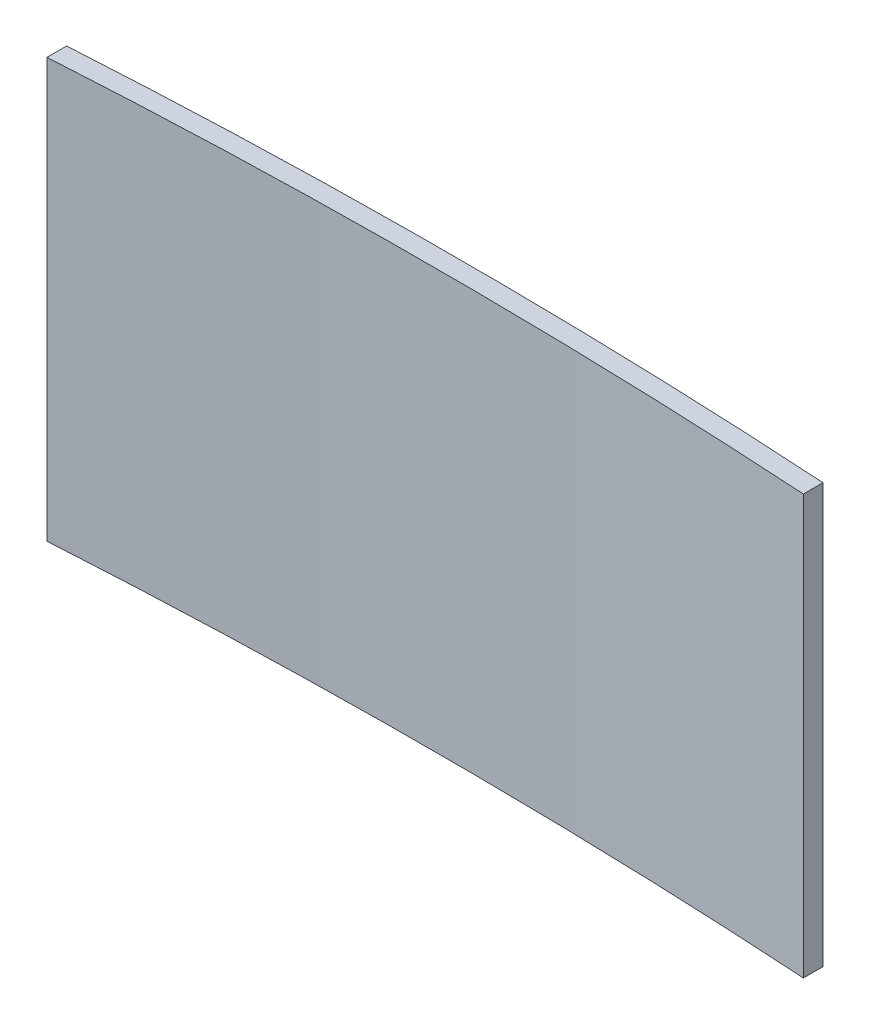
ISO-10303-21;
HEADER;
FILE_DESCRIPTION(('STEP AP214'),'2;1');
FILE_NAME('part.step','',(''),(''),'','','');
FILE_SCHEMA(('AUTOMOTIVE_DESIGN { 1 0 10303 214 1 1 1 1 }'));
ENDSEC;
DATA;
#1=APPLICATION_CONTEXT('core data for automotive mechanical design processes');
#2=APPLICATION_PROTOCOL_DEFINITION('international standard','automotive_design',2000,#1);
#3=PRODUCT_CONTEXT('',#1,'mechanical');
#4=PRODUCT('Part','Part','',(#3));
#5=PRODUCT_RELATED_PRODUCT_CATEGORY('part','',(#4));
#6=PRODUCT_DEFINITION_FORMATION('','',#4);
#7=PRODUCT_DEFINITION_CONTEXT('part definition',#1,'design');
#8=PRODUCT_DEFINITION('design','',#6,#7);
#9=PRODUCT_DEFINITION_SHAPE('','',#8);
#10=(LENGTH_UNIT() NAMED_UNIT(*) SI_UNIT(.MILLI.,.METRE.));
#11=(NAMED_UNIT(*) PLANE_ANGLE_UNIT() SI_UNIT($,.RADIAN.));
#12=(NAMED_UNIT(*) SI_UNIT($,.STERADIAN.) SOLID_ANGLE_UNIT());
#13=UNCERTAINTY_MEASURE_WITH_UNIT(LENGTH_MEASURE(1.E-05),#10,'distance_accuracy_value','');
#14=(GEOMETRIC_REPRESENTATION_CONTEXT(3) GLOBAL_UNCERTAINTY_ASSIGNED_CONTEXT((#13)) GLOBAL_UNIT_ASSIGNED_CONTEXT((#10,
#11,#12)) REPRESENTATION_CONTEXT('',''));
#15=CARTESIAN_POINT('',(0.,0.,0.));
#16=DIRECTION('',(0.,0.,1.));
#17=DIRECTION('',(1.,0.,0.));
#18=AXIS2_PLACEMENT_3D('',#15,#16,#17);
#19=CARTESIAN_POINT('',(491.323179940125,271.78,-12.6755540293957));
#20=CARTESIAN_POINT('',(470.827973191495,271.78,-13.9490476156154));
#21=CARTESIAN_POINT('',(429.805779111009,271.78,-16.1794962238601));
#22=CARTESIAN_POINT('',(347.793788141539,271.78,-19.3642777149448));
#23=CARTESIAN_POINT('',(245.2677848,271.78,-20.9571481900368));
#24=CARTESIAN_POINT('',(142.741781458461,271.78,-19.3642777149448));
#25=CARTESIAN_POINT('',(60.7297904889909,271.78,-16.1794962238601));
#26=CARTESIAN_POINT('',(19.7075964085049,271.78,-13.9490476156154));
#27=CARTESIAN_POINT('',(-0.787610340124819,271.78,-12.6755540293957));
#28=B_SPLINE_CURVE_WITH_KNOTS('',3,(#19,#20,#21,#22,#23,#24,#25,#26,#27),.UNSPECIFIED.,.F.,.F.,
(4,1,1,1,1,1,4),(0.,0.125,0.25,0.5,0.75,0.875,1.),.UNSPECIFIED.);
#29=DIRECTION('',(0.,-1.,0.));
#30=VECTOR('',#29,1.);
#31=SURFACE_OF_LINEAR_EXTRUSION('',#28,#30);
#32=DIRECTION('',(0.,-1.,0.));
#33=VECTOR('',#32,1.);
#34=CARTESIAN_POINT('',(19.0500000000001,135.89,-13.8584747417943));
#35=LINE('',#34,#33);
#36=CARTESIAN_POINT('',(19.0500000000001,226.568,-13.8584747417943));
#37=VERTEX_POINT('',#36);
#38=CARTESIAN_POINT('',(19.0500000000001,239.268,-13.8584747417943));
#39=VERTEX_POINT('',#38);
#40=EDGE_CURVE('E120',#37,#39,#35,.F.);
#41=ORIENTED_EDGE('',*,*,#40,.T.);
#42=CARTESIAN_POINT('',(491.323179940125,239.268,-12.6755540293957));
#43=CARTESIAN_POINT('',(470.827973191495,239.268,-13.9490476156154));
#44=CARTESIAN_POINT('',(429.805779111009,239.268,-16.1794962238601));
#45=CARTESIAN_POINT('',(347.793788141539,239.268,-19.3642777149448));
#46=CARTESIAN_POINT('',(245.2677848,239.268,-20.9571481900368));
#47=CARTESIAN_POINT('',(142.741781458461,239.268,-19.3642777149448));
#48=CARTESIAN_POINT('',(60.7297904889909,239.268,-16.1794962238601));
#49=CARTESIAN_POINT('',(19.7075964085049,239.268,-13.9490476156154));
#50=CARTESIAN_POINT('',(-0.787610340124819,239.268,-12.6755540293957));
#51=B_SPLINE_CURVE_WITH_KNOTS('',3,(#42,#43,#44,#45,#46,#47,#48,#49,#50),.UNSPECIFIED.,.F.,.F.,
(4,1,1,1,1,1,4),(0.,0.125,0.25,0.5,0.75,0.875,1.),.UNSPECIFIED.);
#52=CARTESIAN_POINT('',(6.35000000975737,239.268,-13.1126204784804));
#53=VERTEX_POINT('',#52);
#54=EDGE_CURVE('E146',#39,#53,#51,.T.);
#55=ORIENTED_EDGE('',*,*,#54,.T.);
#56=DIRECTION('',(0.,-1.,0.));
#57=VECTOR('',#56,1.);
#58=CARTESIAN_POINT('',(6.35000000000018,271.78,-13.1126204778917));
#59=LINE('',#58,#57);
#60=CARTESIAN_POINT('',(6.35000000000017,226.568,-13.1126204778917));
#61=VERTEX_POINT('',#60);
#62=EDGE_CURVE('E141',#53,#61,#59,.T.);
#63=ORIENTED_EDGE('',*,*,#62,.T.);
#64=CARTESIAN_POINT('',(491.323179940125,226.568,-12.6755540293957));
#65=CARTESIAN_POINT('',(470.827973191495,226.568,-13.9490476156154));
#66=CARTESIAN_POINT('',(429.805779111009,226.568,-16.1794962238601));
#67=CARTESIAN_POINT('',(347.793788141539,226.568,-19.3642777149448));
#68=CARTESIAN_POINT('',(245.2677848,226.568,-20.9571481900368));
#69=CARTESIAN_POINT('',(142.741781458461,226.568,-19.3642777149448));
#70=CARTESIAN_POINT('',(60.7297904889909,226.568,-16.1794962238601));
#71=CARTESIAN_POINT('',(19.7075964085049,226.568,-13.9490476156154));
#72=CARTESIAN_POINT('',(-0.787610340124819,226.568,-12.6755540293957));
#73=B_SPLINE_CURVE_WITH_KNOTS('',3,(#64,#65,#66,#67,#68,#69,#70,#71,#72),.UNSPECIFIED.,.F.,.F.,
(4,1,1,1,1,1,4),(0.,0.125,0.25,0.5,0.75,0.875,1.),.UNSPECIFIED.);
#74=EDGE_CURVE('E133',#61,#37,#73,.F.);
#75=ORIENTED_EDGE('',*,*,#74,.T.);
#76=EDGE_LOOP('',(#41,#55,#63,#75));
#77=FACE_BOUND('',#76,.T.);
#78=DIRECTION('',(0.,-1.,0.));
#79=VECTOR('',#78,1.);
#80=CARTESIAN_POINT('',(471.4855696,271.78,-13.8584747417943));
#81=LINE('',#80,#79);
#82=CARTESIAN_POINT('',(471.4855696,226.568,-13.8584747417908));
#83=VERTEX_POINT('',#82);
#84=CARTESIAN_POINT('',(471.485569600061,239.268,-13.8584747417908));
#85=VERTEX_POINT('',#84);
#86=EDGE_CURVE('E42',#83,#85,#81,.F.);
#87=ORIENTED_EDGE('',*,*,#86,.F.);
#88=CARTESIAN_POINT('',(491.323179940125,226.568,-12.6755540293957));
#89=CARTESIAN_POINT('',(470.827973191495,226.568,-13.9490476156154));
#90=CARTESIAN_POINT('',(429.805779111009,226.568,-16.1794962238601));
#91=CARTESIAN_POINT('',(347.793788141539,226.568,-19.3642777149448));
#92=CARTESIAN_POINT('',(245.2677848,226.568,-20.9571481900368));
#93=CARTESIAN_POINT('',(142.741781458461,226.568,-19.3642777149448));
#94=CARTESIAN_POINT('',(60.7297904889909,226.568,-16.1794962238601));
#95=CARTESIAN_POINT('',(19.7075964085049,226.568,-13.9490476156154));
#96=CARTESIAN_POINT('',(-0.787610340124819,226.568,-12.6755540293957));
#97=B_SPLINE_CURVE_WITH_KNOTS('',3,(#88,#89,#90,#91,#92,#93,#94,#95,#96),.UNSPECIFIED.,.F.,.F.,
(4,1,1,1,1,1,4),(0.,0.125,0.25,0.5,0.75,0.875,1.),.UNSPECIFIED.);
#98=CARTESIAN_POINT('',(484.185569590243,226.568,-13.1126204784804));
#99=VERTEX_POINT('',#98);
#100=EDGE_CURVE('E142',#99,#83,#97,.T.);
#101=ORIENTED_EDGE('',*,*,#100,.F.);
#102=DIRECTION('',(0.,-1.,0.));
#103=VECTOR('',#102,1.);
#104=CARTESIAN_POINT('',(484.1855696,271.78,-13.1126204778917));
#105=LINE('',#104,#103);
#106=CARTESIAN_POINT('',(484.1855696,239.268,-13.1126204778917));
#107=VERTEX_POINT('',#106);
#108=EDGE_CURVE('E54',#107,#99,#105,.T.);
#109=ORIENTED_EDGE('',*,*,#108,.F.);
#110=CARTESIAN_POINT('',(491.323179940125,239.268,-12.6755540293957));
#111=CARTESIAN_POINT('',(470.827973191495,239.268,-13.9490476156154));
#112=CARTESIAN_POINT('',(429.805779111009,239.268,-16.1794962238601));
#113=CARTESIAN_POINT('',(347.793788141539,239.268,-19.3642777149448));
#114=CARTESIAN_POINT('',(245.2677848,239.268,-20.9571481900368));
#115=CARTESIAN_POINT('',(142.741781458461,239.268,-19.3642777149448));
#116=CARTESIAN_POINT('',(60.7297904889909,239.268,-16.1794962238601));
#117=CARTESIAN_POINT('',(19.7075964085049,239.268,-13.9490476156154));
#118=CARTESIAN_POINT('',(-0.787610340124819,239.268,-12.6755540293957));
#119=B_SPLINE_CURVE_WITH_KNOTS('',3,(#110,#111,#112,#113,#114,#115,#116,#117,#118),
.UNSPECIFIED.,.F.,.F.,(4,1,1,1,1,1,4),(0.,0.125,0.25,0.5,0.75,0.875,1.),.UNSPECIFIED.);
#120=EDGE_CURVE('E49',#85,#107,#119,.F.);
#121=ORIENTED_EDGE('',*,*,#120,.F.);
#122=EDGE_LOOP('',(#87,#101,#109,#121));
#123=FACE_BOUND('',#122,.T.);
#124=CARTESIAN_POINT('',(491.323179940125,0.,-12.6755540293957));
#125=CARTESIAN_POINT('',(470.827973191495,0.,-13.9490476156154));
#126=CARTESIAN_POINT('',(429.805779111009,0.,-16.1794962238601));
#127=CARTESIAN_POINT('',(347.793788141539,0.,-19.3642777149448));
#128=CARTESIAN_POINT('',(245.2677848,0.,-20.9571481900368));
#129=CARTESIAN_POINT('',(142.741781458461,0.,-19.3642777149448));
#130=CARTESIAN_POINT('',(60.7297904889909,0.,-16.1794962238601));
#131=CARTESIAN_POINT('',(19.7075964085049,0.,-13.9490476156154));
#132=CARTESIAN_POINT('',(-0.787610340124819,0.,-12.6755540293957));
#133=B_SPLINE_CURVE_WITH_KNOTS('',3,(#124,#125,#126,#127,#128,#129,#130,#131,#132),
.UNSPECIFIED.,.F.,.F.,(4,1,1,1,1,1,4),(0.,0.125,0.25,0.5,0.75,0.875,1.),.UNSPECIFIED.);
#134=CARTESIAN_POINT('',(490.535569595811,0.,-12.7244147225897));
#135=VERTEX_POINT('',#134);
#136=CARTESIAN_POINT('',(0.,0.,-12.7244147902248));
#137=VERTEX_POINT('',#136);
#138=EDGE_CURVE('E251',#135,#137,#133,.T.);
#139=ORIENTED_EDGE('',*,*,#138,.T.);
#140=DIRECTION('',(0.,-1.,0.));
#141=VECTOR('',#140,1.);
#142=CARTESIAN_POINT('',(0.,271.78,-12.7244147902248));
#143=LINE('',#142,#141);
#144=CARTESIAN_POINT('',(0.,271.78,-12.7244147902248));
#145=VERTEX_POINT('',#144);
#146=EDGE_CURVE('E256',#145,#137,#143,.T.);
#147=ORIENTED_EDGE('',*,*,#146,.F.);
#148=CARTESIAN_POINT('',(490.535569595811,271.78,-12.7244147225897));
#149=VERTEX_POINT('',#148);
#150=EDGE_CURVE('E214',#149,#145,#28,.T.);
#151=ORIENTED_EDGE('',*,*,#150,.F.);
#152=DIRECTION('',(0.,-1.,0.));
#153=VECTOR('',#152,1.);
#154=CARTESIAN_POINT('',(490.535569595811,271.78,-12.7244147225897));
#155=LINE('',#154,#153);
#156=EDGE_CURVE('E243',#149,#135,#155,.T.);
#157=ORIENTED_EDGE('',*,*,#156,.T.);
#158=EDGE_LOOP('',(#139,#147,#151,#157));
#159=FACE_BOUND('',#158,.T.);
#160=ADVANCED_FACE('F33',(#77,#123,#159),#31,.F.);
#161=CARTESIAN_POINT('',(0.,271.78,0.));
#162=CARTESIAN_POINT('',(245.2677848,271.78,-15.2399999999999));
#163=CARTESIAN_POINT('',(490.5355696,271.78,0.));
#164=B_SPLINE_CURVE_WITH_KNOTS('',2,(#161,#162,#163),.UNSPECIFIED.,.F.,.F.,(3,3),(0.,1.),.UNSPECIFIED.);
#165=DIRECTION('',(0.,-1.,0.));
#166=VECTOR('',#165,1.);
#167=SURFACE_OF_LINEAR_EXTRUSION('',#164,#166);
#168=CARTESIAN_POINT('',(0.,0.,0.));
#169=CARTESIAN_POINT('',(245.2677848,0.,-15.2399999999999));
#170=CARTESIAN_POINT('',(490.5355696,0.,0.));
#171=B_SPLINE_CURVE_WITH_KNOTS('',2,(#168,#169,#170),.UNSPECIFIED.,.F.,.F.,(3,3),(0.,1.),.UNSPECIFIED.);
#172=CARTESIAN_POINT('',(0.,0.,0.));
#173=VERTEX_POINT('',#172);
#174=CARTESIAN_POINT('',(490.5355696,0.,0.));
#175=VERTEX_POINT('',#174);
#176=EDGE_CURVE('E200',#173,#175,#171,.T.);
#177=ORIENTED_EDGE('',*,*,#176,.T.);
#178=DIRECTION('',(0.,-1.,0.));
#179=VECTOR('',#178,1.);
#180=CARTESIAN_POINT('',(490.5355696,271.78,0.));
#181=LINE('',#180,#179);
#182=CARTESIAN_POINT('',(490.5355696,271.78,0.));
#183=VERTEX_POINT('',#182);
#184=EDGE_CURVE('E246',#183,#175,#181,.T.);
#185=ORIENTED_EDGE('',*,*,#184,.F.);
#186=CARTESIAN_POINT('',(0.,271.78,0.));
#187=VERTEX_POINT('',#186);
#188=EDGE_CURVE('E202',#187,#183,#164,.T.);
#189=ORIENTED_EDGE('',*,*,#188,.F.);
#190=DIRECTION('',(0.,-1.,0.));
#191=VECTOR('',#190,1.);
#192=CARTESIAN_POINT('',(0.,271.78,0.));
#193=LINE('',#192,#191);
#194=EDGE_CURVE('E268',#187,#173,#193,.T.);
#195=ORIENTED_EDGE('',*,*,#194,.T.);
#196=EDGE_LOOP('',(#177,#185,#189,#195));
#197=FACE_BOUND('',#196,.T.);
#198=ADVANCED_FACE('F35',(#197),#167,.F.);
#199=CARTESIAN_POINT('',(490.5355696,271.78,-12.7244147902248));
#200=DIRECTION('',(-1.,0.,0.));
#201=DIRECTION('',(0.,0.,1.));
#202=AXIS2_PLACEMENT_3D('',#199,#200,#201);
#203=PLANE('',#202);
#204=DIRECTION('',(0.,0.,-1.));
#205=VECTOR('',#204,1.);
#206=CARTESIAN_POINT('',(490.5355696,0.,-12.7244147902248));
#207=LINE('',#206,#205);
#208=EDGE_CURVE('E241',#175,#135,#207,.T.);
#209=ORIENTED_EDGE('',*,*,#208,.T.);
#210=ORIENTED_EDGE('',*,*,#156,.F.);
#211=DIRECTION('',(0.,0.,-1.));
#212=VECTOR('',#211,1.);
#213=CARTESIAN_POINT('',(490.5355696,271.78,-12.7244147902248));
#214=LINE('',#213,#212);
#215=EDGE_CURVE('E208',#183,#149,#214,.T.);
#216=ORIENTED_EDGE('',*,*,#215,.F.);
#217=ORIENTED_EDGE('',*,*,#184,.T.);
#218=EDGE_LOOP('',(#209,#210,#216,#217));
#219=FACE_BOUND('',#218,.T.);
#220=ADVANCED_FACE('F229',(#219),#203,.F.);
#221=CARTESIAN_POINT('',(0.,271.78,0.));
#222=DIRECTION('',(1.,0.,0.));
#223=DIRECTION('',(0.,0.,-1.));
#224=AXIS2_PLACEMENT_3D('',#221,#222,#223);
#225=PLANE('',#224);
#226=DIRECTION('',(0.,0.,1.));
#227=VECTOR('',#226,1.);
#228=CARTESIAN_POINT('',(0.,0.,0.));
#229=LINE('',#228,#227);
#230=EDGE_CURVE('E209',#137,#173,#229,.T.);
#231=ORIENTED_EDGE('',*,*,#230,.T.);
#232=ORIENTED_EDGE('',*,*,#194,.F.);
#233=DIRECTION('',(0.,0.,1.));
#234=VECTOR('',#233,1.);
#235=CARTESIAN_POINT('',(0.,271.78,0.));
#236=LINE('',#235,#234);
#237=EDGE_CURVE('E219',#145,#187,#236,.T.);
#238=ORIENTED_EDGE('',*,*,#237,.F.);
#239=ORIENTED_EDGE('',*,*,#146,.T.);
#240=EDGE_LOOP('',(#231,#232,#238,#239));
#241=FACE_BOUND('',#240,.T.);
#242=ADVANCED_FACE('F227',(#241),#225,.F.);
#243=CARTESIAN_POINT('',(245.2677848,271.78,-7.61999999999997));
#244=DIRECTION('',(0.,1.,0.));
#245=DIRECTION('',(0.,0.,1.));
#246=AXIS2_PLACEMENT_3D('',#243,#244,#245);
#247=PLANE('',#246);
#248=ORIENTED_EDGE('',*,*,#188,.T.);
#249=ORIENTED_EDGE('',*,*,#215,.T.);
#250=ORIENTED_EDGE('',*,*,#150,.T.);
#251=ORIENTED_EDGE('',*,*,#237,.T.);
#252=EDGE_LOOP('',(#248,#249,#250,#251));
#253=FACE_BOUND('',#252,.T.);
#254=ADVANCED_FACE('F236',(#253),#247,.T.);
#255=CARTESIAN_POINT('',(245.2677848,0.,-7.61999999999997));
#256=DIRECTION('',(0.,1.,0.));
#257=DIRECTION('',(0.,0.,1.));
#258=AXIS2_PLACEMENT_3D('',#255,#256,#257);
#259=PLANE('',#258);
#260=ORIENTED_EDGE('',*,*,#176,.F.);
#261=ORIENTED_EDGE('',*,*,#230,.F.);
#262=ORIENTED_EDGE('',*,*,#138,.F.);
#263=ORIENTED_EDGE('',*,*,#208,.F.);
#264=EDGE_LOOP('',(#260,#261,#262,#263));
#265=FACE_BOUND('',#264,.T.);
#266=ADVANCED_FACE('F259',(#265),#259,.F.);
#267=CARTESIAN_POINT('',(6.35000000000017,226.568,-16.51));
#268=DIRECTION('',(0.,-1.,0.));
#269=DIRECTION('',(0.,0.,-1.));
#270=AXIS2_PLACEMENT_3D('',#267,#268,#269);
#271=PLANE('',#270);
#272=DIRECTION('',(0.,0.,-1.));
#273=VECTOR('',#272,1.);
#274=CARTESIAN_POINT('',(19.0500000000001,226.568,-16.51));
#275=LINE('',#274,#273);
#276=CARTESIAN_POINT('',(19.0500000000001,226.568,-16.51));
#277=VERTEX_POINT('',#276);
#278=EDGE_CURVE('E123',#37,#277,#275,.T.);
#279=ORIENTED_EDGE('',*,*,#278,.F.);
#280=ORIENTED_EDGE('',*,*,#74,.F.);
#281=DIRECTION('',(0.,0.,1.));
#282=VECTOR('',#281,1.);
#283=CARTESIAN_POINT('',(6.35000000000017,226.568,-16.51));
#284=LINE('',#283,#282);
#285=CARTESIAN_POINT('',(6.35000000000017,226.568,-16.51));
#286=VERTEX_POINT('',#285);
#287=EDGE_CURVE('E198',#286,#61,#284,.T.);
#288=ORIENTED_EDGE('',*,*,#287,.F.);
#289=DIRECTION('',(1.,0.,0.));
#290=VECTOR('',#289,1.);
#291=CARTESIAN_POINT('',(6.35000000000017,226.568,-16.51));
#292=LINE('',#291,#290);
#293=EDGE_CURVE('E136',#286,#277,#292,.T.);
#294=ORIENTED_EDGE('',*,*,#293,.T.);
#295=EDGE_LOOP('',(#279,#280,#288,#294));
#296=FACE_BOUND('',#295,.T.);
#297=ADVANCED_FACE('F132',(#296),#271,.T.);
#298=CARTESIAN_POINT('',(6.35000000000017,239.268,-16.51));
#299=DIRECTION('',(-1.,0.,0.));
#300=DIRECTION('',(0.,-1.,0.));
#301=AXIS2_PLACEMENT_3D('',#298,#299,#300);
#302=PLANE('',#301);
#303=ORIENTED_EDGE('',*,*,#62,.F.);
#304=DIRECTION('',(0.,0.,1.));
#305=VECTOR('',#304,1.);
#306=CARTESIAN_POINT('',(6.35000000000017,239.268,-16.51));
#307=LINE('',#306,#305);
#308=CARTESIAN_POINT('',(6.35000000000017,239.268,-16.51));
#309=VERTEX_POINT('',#308);
#310=EDGE_CURVE('E197',#309,#53,#307,.T.);
#311=ORIENTED_EDGE('',*,*,#310,.F.);
#312=DIRECTION('',(0.,-1.,0.));
#313=VECTOR('',#312,1.);
#314=CARTESIAN_POINT('',(6.35000000000017,239.268,-16.51));
#315=LINE('',#314,#313);
#316=EDGE_CURVE('E184',#309,#286,#315,.T.);
#317=ORIENTED_EDGE('',*,*,#316,.T.);
#318=ORIENTED_EDGE('',*,*,#287,.T.);
#319=EDGE_LOOP('',(#303,#311,#317,#318));
#320=FACE_BOUND('',#319,.T.);
#321=ADVANCED_FACE('F283',(#320),#302,.T.);
#322=CARTESIAN_POINT('',(19.0500000000002,239.268,-16.51));
#323=DIRECTION('',(0.,1.,0.));
#324=DIRECTION('',(0.,0.,1.));
#325=AXIS2_PLACEMENT_3D('',#322,#323,#324);
#326=PLANE('',#325);
#327=DIRECTION('',(0.,0.,1.));
#328=VECTOR('',#327,1.);
#329=CARTESIAN_POINT('',(19.0500000000001,239.268,-16.51));
#330=LINE('',#329,#328);
#331=CARTESIAN_POINT('',(19.0500000000001,239.268,-16.51));
#332=VERTEX_POINT('',#331);
#333=EDGE_CURVE('E125',#332,#39,#330,.T.);
#334=ORIENTED_EDGE('',*,*,#333,.F.);
#335=DIRECTION('',(-1.,0.,0.));
#336=VECTOR('',#335,1.);
#337=CARTESIAN_POINT('',(19.0500000000002,239.268,-16.51));
#338=LINE('',#337,#336);
#339=EDGE_CURVE('E181',#332,#309,#338,.T.);
#340=ORIENTED_EDGE('',*,*,#339,.T.);
#341=ORIENTED_EDGE('',*,*,#310,.T.);
#342=ORIENTED_EDGE('',*,*,#54,.F.);
#343=EDGE_LOOP('',(#334,#340,#341,#342));
#344=FACE_BOUND('',#343,.T.);
#345=ADVANCED_FACE('F279',(#344),#326,.T.);
#346=CARTESIAN_POINT('',(0.,0.,-16.51));
#347=DIRECTION('',(0.,0.,1.));
#348=DIRECTION('',(1.,0.,0.));
#349=AXIS2_PLACEMENT_3D('',#346,#347,#348);
#350=PLANE('',#349);
#351=ORIENTED_EDGE('',*,*,#339,.F.);
#352=DIRECTION('',(0.,-1.,0.));
#353=VECTOR('',#352,1.);
#354=CARTESIAN_POINT('',(19.0500000000001,0.,-16.51));
#355=LINE('',#354,#353);
#356=EDGE_CURVE('E11',#332,#277,#355,.T.);
#357=ORIENTED_EDGE('',*,*,#356,.T.);
#358=ORIENTED_EDGE('',*,*,#293,.F.);
#359=ORIENTED_EDGE('',*,*,#316,.F.);
#360=EDGE_LOOP('',(#351,#357,#358,#359));
#361=FACE_BOUND('',#360,.T.);
#362=ADVANCED_FACE('F285',(#361),#350,.F.);
#363=CARTESIAN_POINT('',(471.4855696,226.568,-16.5099999999991));
#364=DIRECTION('',(1.,0.,0.));
#365=DIRECTION('',(0.,0.,-1.));
#366=AXIS2_PLACEMENT_3D('',#363,#364,#365);
#367=PLANE('',#366);
#368=DIRECTION('',(0.,0.,1.));
#369=VECTOR('',#368,1.);
#370=CARTESIAN_POINT('',(471.4855696,226.568,-16.5099999999991));
#371=LINE('',#370,#369);
#372=CARTESIAN_POINT('',(471.4855696,226.568,-16.5099999999991));
#373=VERTEX_POINT('',#372);
#374=EDGE_CURVE('E174',#373,#83,#371,.T.);
#375=ORIENTED_EDGE('',*,*,#374,.T.);
#376=ORIENTED_EDGE('',*,*,#86,.T.);
#377=DIRECTION('',(0.,0.,1.));
#378=VECTOR('',#377,1.);
#379=CARTESIAN_POINT('',(471.4855696,239.268,-16.5099999999991));
#380=LINE('',#379,#378);
#381=CARTESIAN_POINT('',(471.4855696,239.268,-16.5099999999991));
#382=VERTEX_POINT('',#381);
#383=EDGE_CURVE('E172',#382,#85,#380,.T.);
#384=ORIENTED_EDGE('',*,*,#383,.F.);
#385=DIRECTION('',(0.,1.,0.));
#386=VECTOR('',#385,1.);
#387=CARTESIAN_POINT('',(471.4855696,226.568,-16.5099999999991));
#388=LINE('',#387,#386);
#389=EDGE_CURVE('E137',#373,#382,#388,.T.);
#390=ORIENTED_EDGE('',*,*,#389,.F.);
#391=EDGE_LOOP('',(#375,#376,#384,#390));
#392=FACE_BOUND('',#391,.T.);
#393=ADVANCED_FACE('F170',(#392),#367,.F.);
#394=CARTESIAN_POINT('',(471.4855696,239.268,-16.5099999999991));
#395=DIRECTION('',(0.,-1.,0.));
#396=DIRECTION('',(0.,0.,-1.));
#397=AXIS2_PLACEMENT_3D('',#394,#395,#396);
#398=PLANE('',#397);
#399=ORIENTED_EDGE('',*,*,#383,.T.);
#400=ORIENTED_EDGE('',*,*,#120,.T.);
#401=DIRECTION('',(0.,0.,1.));
#402=VECTOR('',#401,1.);
#403=CARTESIAN_POINT('',(484.1855696,239.268,-16.5099999999991));
#404=LINE('',#403,#402);
#405=CARTESIAN_POINT('',(484.1855696,239.268,-16.5099999999991));
#406=VERTEX_POINT('',#405);
#407=EDGE_CURVE('E182',#406,#107,#404,.T.);
#408=ORIENTED_EDGE('',*,*,#407,.F.);
#409=DIRECTION('',(1.,0.,0.));
#410=VECTOR('',#409,1.);
#411=CARTESIAN_POINT('',(471.4855696,239.268,-16.5099999999991));
#412=LINE('',#411,#410);
#413=EDGE_CURVE('E179',#382,#406,#412,.T.);
#414=ORIENTED_EDGE('',*,*,#413,.F.);
#415=EDGE_LOOP('',(#399,#400,#408,#414));
#416=FACE_BOUND('',#415,.T.);
#417=ADVANCED_FACE('F176',(#416),#398,.F.);
#418=CARTESIAN_POINT('',(484.1855696,239.268,-16.5099999999991));
#419=DIRECTION('',(-1.,0.,0.));
#420=DIRECTION('',(0.,0.,1.));
#421=AXIS2_PLACEMENT_3D('',#418,#419,#420);
#422=PLANE('',#421);
#423=ORIENTED_EDGE('',*,*,#407,.T.);
#424=ORIENTED_EDGE('',*,*,#108,.T.);
#425=DIRECTION('',(0.,0.,1.));
#426=VECTOR('',#425,1.);
#427=CARTESIAN_POINT('',(484.1855696,226.568,-16.5099999999991));
#428=LINE('',#427,#426);
#429=CARTESIAN_POINT('',(484.1855696,226.568,-16.5099999999991));
#430=VERTEX_POINT('',#429);
#431=EDGE_CURVE('E186',#430,#99,#428,.T.);
#432=ORIENTED_EDGE('',*,*,#431,.F.);
#433=DIRECTION('',(0.,-1.,0.));
#434=VECTOR('',#433,1.);
#435=CARTESIAN_POINT('',(484.1855696,239.268,-16.5099999999991));
#436=LINE('',#435,#434);
#437=EDGE_CURVE('E290',#406,#430,#436,.T.);
#438=ORIENTED_EDGE('',*,*,#437,.F.);
#439=EDGE_LOOP('',(#423,#424,#432,#438));
#440=FACE_BOUND('',#439,.T.);
#441=ADVANCED_FACE('F296',(#440),#422,.F.);
#442=CARTESIAN_POINT('',(484.1855696,226.568,-16.5099999999991));
#443=DIRECTION('',(0.,1.,0.));
#444=DIRECTION('',(0.,0.,1.));
#445=AXIS2_PLACEMENT_3D('',#442,#443,#444);
#446=PLANE('',#445);
#447=ORIENTED_EDGE('',*,*,#431,.T.);
#448=ORIENTED_EDGE('',*,*,#100,.T.);
#449=ORIENTED_EDGE('',*,*,#374,.F.);
#450=DIRECTION('',(-1.,0.,0.));
#451=VECTOR('',#450,1.);
#452=CARTESIAN_POINT('',(484.1855696,226.568,-16.5099999999991));
#453=LINE('',#452,#451);
#454=EDGE_CURVE('E289',#430,#373,#453,.T.);
#455=ORIENTED_EDGE('',*,*,#454,.F.);
#456=EDGE_LOOP('',(#447,#448,#449,#455));
#457=FACE_BOUND('',#456,.T.);
#458=ADVANCED_FACE('F299',(#457),#446,.F.);
#459=CARTESIAN_POINT('',(490.5355696,0.,-16.509999999999));
#460=DIRECTION('',(0.,0.,1.));
#461=DIRECTION('',(-1.,0.,0.));
#462=AXIS2_PLACEMENT_3D('',#459,#460,#461);
#463=PLANE('',#462);
#464=ORIENTED_EDGE('',*,*,#389,.T.);
#465=ORIENTED_EDGE('',*,*,#413,.T.);
#466=ORIENTED_EDGE('',*,*,#437,.T.);
#467=ORIENTED_EDGE('',*,*,#454,.T.);
#468=EDGE_LOOP('',(#464,#465,#466,#467));
#469=FACE_BOUND('',#468,.T.);
#470=ADVANCED_FACE('F294',(#469),#463,.F.);
#471=CARTESIAN_POINT('',(19.0500000000001,0.,-13.8584747417913));
#472=DIRECTION('',(-1.,0.,0.));
#473=DIRECTION('',(0.,0.,1.));
#474=AXIS2_PLACEMENT_3D('',#471,#472,#473);
#475=PLANE('',#474);
#476=ORIENTED_EDGE('',*,*,#278,.T.);
#477=ORIENTED_EDGE('',*,*,#356,.F.);
#478=ORIENTED_EDGE('',*,*,#333,.T.);
#479=ORIENTED_EDGE('',*,*,#40,.F.);
#480=EDGE_LOOP('',(#476,#477,#478,#479));
#481=FACE_BOUND('',#480,.T.);
#482=ADVANCED_FACE('F122',(#481),#475,.F.);
#483=CLOSED_SHELL('',(#160,#198,#220,#242,#254,#266,#297,#321,#345,#362,#393,#417,#441,#458,
#470,#482));
#484=MANIFOLD_SOLID_BREP('B2',#483);
#485=ADVANCED_BREP_SHAPE_REPRESENTATION('',(#18,#484),#14);
#486=SHAPE_DEFINITION_REPRESENTATION(#9,#485);
ENDSEC;
END-ISO-10303-21;
